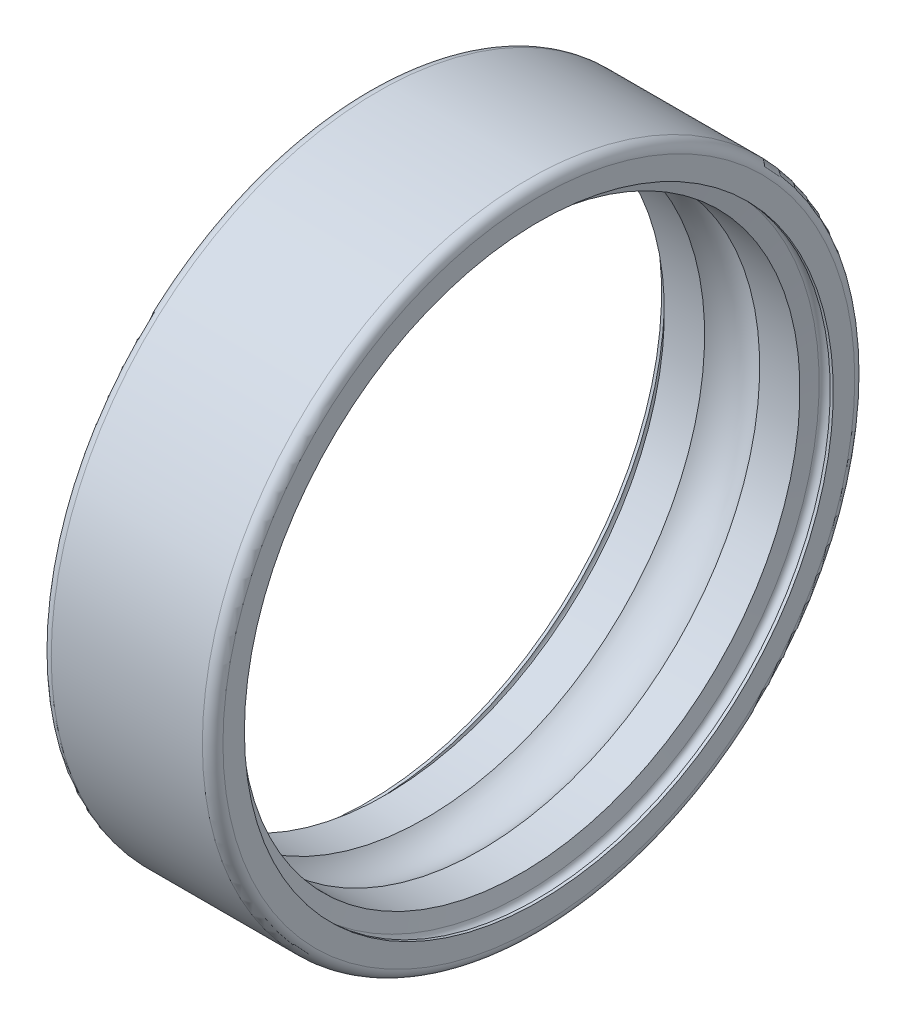
ISO-10303-21;
HEADER;
FILE_DESCRIPTION(('STEP AP214'),'2;1');
FILE_NAME('part.step','',(''),(''),'','','');
FILE_SCHEMA(('AUTOMOTIVE_DESIGN { 1 0 10303 214 1 1 1 1 }'));
ENDSEC;
DATA;
#1=APPLICATION_CONTEXT('core data for automotive mechanical design processes');
#2=APPLICATION_PROTOCOL_DEFINITION('international standard','automotive_design',2000,#1);
#3=PRODUCT_CONTEXT('',#1,'mechanical');
#4=PRODUCT('Part','Part','',(#3));
#5=PRODUCT_RELATED_PRODUCT_CATEGORY('part','',(#4));
#6=PRODUCT_DEFINITION_FORMATION('','',#4);
#7=PRODUCT_DEFINITION_CONTEXT('part definition',#1,'design');
#8=PRODUCT_DEFINITION('design','',#6,#7);
#9=PRODUCT_DEFINITION_SHAPE('','',#8);
#10=(LENGTH_UNIT() NAMED_UNIT(*) SI_UNIT(.MILLI.,.METRE.));
#11=(NAMED_UNIT(*) PLANE_ANGLE_UNIT() SI_UNIT($,.RADIAN.));
#12=(NAMED_UNIT(*) SI_UNIT($,.STERADIAN.) SOLID_ANGLE_UNIT());
#13=UNCERTAINTY_MEASURE_WITH_UNIT(LENGTH_MEASURE(1.E-05),#10,'distance_accuracy_value','');
#14=(GEOMETRIC_REPRESENTATION_CONTEXT(3) GLOBAL_UNCERTAINTY_ASSIGNED_CONTEXT((#13)) GLOBAL_UNIT_ASSIGNED_CONTEXT((#10,
#11,#12)) REPRESENTATION_CONTEXT('',''));
#15=CARTESIAN_POINT('',(0.,0.,0.));
#16=DIRECTION('',(0.,0.,1.));
#17=DIRECTION('',(1.,0.,0.));
#18=AXIS2_PLACEMENT_3D('',#15,#16,#17);
#19=CARTESIAN_POINT('',(4.47378855666907,0.,0.));
#20=DIRECTION('',(1.,0.,0.));
#21=DIRECTION('',(0.,0.,-1.));
#22=AXIS2_PLACEMENT_3D('',#19,#20,#21);
#23=CONICAL_SURFACE('',#22,8.13,1.39626340159546);
#24=CARTESIAN_POINT('',(4.55770421996383,0.,0.));
#25=DIRECTION('',(-1.,0.,0.));
#26=DIRECTION('',(0.,0.,1.));
#27=AXIS2_PLACEMENT_3D('',#24,#25,#26);
#28=CIRCLE('',#27,8.60590937562471);
#29=CARTESIAN_POINT('',(4.55770421996383,0.,8.60590937562471));
#30=VERTEX_POINT('',#29);
#31=EDGE_CURVE('E10',#30,#30,#28,.T.);
#32=ORIENTED_EDGE('',*,*,#31,.F.);
#33=EDGE_LOOP('',(#32));
#34=FACE_BOUND('',#33,.T.);
#35=CARTESIAN_POINT('',(4.47378855666907,0.,0.));
#36=DIRECTION('',(-1.,0.,0.));
#37=DIRECTION('',(0.,0.,1.));
#38=AXIS2_PLACEMENT_3D('',#35,#36,#37);
#39=CIRCLE('',#38,8.13);
#40=CARTESIAN_POINT('',(4.47378855666907,0.,8.13));
#41=VERTEX_POINT('',#40);
#42=EDGE_CURVE('E80',#41,#41,#39,.T.);
#43=ORIENTED_EDGE('',*,*,#42,.T.);
#44=EDGE_LOOP('',(#43));
#45=FACE_BOUND('',#44,.T.);
#46=ADVANCED_FACE('F14',(#34,#45),#23,.F.);
#47=CARTESIAN_POINT('',(4.733,0.,0.));
#48=DIRECTION('',(-1.,0.,0.));
#49=DIRECTION('',(0.,0.,1.));
#50=AXIS2_PLACEMENT_3D('',#47,#48,#49);
#51=TOROIDAL_SURFACE('',#50,8.575,0.178);
#52=ORIENTED_EDGE('',*,*,#31,.T.);
#53=EDGE_LOOP('',(#52));
#54=FACE_BOUND('',#53,.T.);
#55=CARTESIAN_POINT('',(4.911,0.,0.));
#56=DIRECTION('',(-1.,0.,0.));
#57=DIRECTION('',(0.,0.,1.));
#58=AXIS2_PLACEMENT_3D('',#55,#56,#57);
#59=CIRCLE('',#58,8.575);
#60=CARTESIAN_POINT('',(4.911,0.,8.575));
#61=VERTEX_POINT('',#60);
#62=EDGE_CURVE('E21',#61,#61,#59,.T.);
#63=ORIENTED_EDGE('',*,*,#62,.F.);
#64=EDGE_LOOP('',(#63));
#65=FACE_BOUND('',#64,.T.);
#66=ADVANCED_FACE('F105',(#54,#65),#51,.F.);
#67=CARTESIAN_POINT('',(0.,0.,0.));
#68=DIRECTION('',(-1.,0.,0.));
#69=DIRECTION('',(0.,0.,1.));
#70=AXIS2_PLACEMENT_3D('',#67,#68,#69);
#71=CYLINDRICAL_SURFACE('',#70,8.575);
#72=ORIENTED_EDGE('',*,*,#62,.T.);
#73=EDGE_LOOP('',(#72));
#74=FACE_BOUND('',#73,.T.);
#75=CARTESIAN_POINT('',(5.,0.,0.));
#76=DIRECTION('',(-1.,0.,0.));
#77=DIRECTION('',(0.,0.,1.));
#78=AXIS2_PLACEMENT_3D('',#75,#76,#77);
#79=CIRCLE('',#78,8.575);
#80=CARTESIAN_POINT('',(5.,0.,8.575));
#81=VERTEX_POINT('',#80);
#82=EDGE_CURVE('E30',#81,#81,#79,.T.);
#83=ORIENTED_EDGE('',*,*,#82,.F.);
#84=EDGE_LOOP('',(#83));
#85=FACE_BOUND('',#84,.T.);
#86=ADVANCED_FACE('F110',(#74,#85),#71,.F.);
#87=CARTESIAN_POINT('',(5.,8.575,0.));
#88=DIRECTION('',(-1.,0.,0.));
#89=DIRECTION('',(0.,0.,1.));
#90=AXIS2_PLACEMENT_3D('',#87,#88,#89);
#91=PLANE('',#90);
#92=CARTESIAN_POINT('',(5.,0.,0.));
#93=DIRECTION('',(-1.,0.,0.));
#94=DIRECTION('',(0.,0.,1.));
#95=AXIS2_PLACEMENT_3D('',#92,#93,#94);
#96=CIRCLE('',#95,9.2);
#97=CARTESIAN_POINT('',(5.,0.,9.2));
#98=VERTEX_POINT('',#97);
#99=EDGE_CURVE('E38',#98,#98,#96,.T.);
#100=ORIENTED_EDGE('',*,*,#99,.F.);
#101=EDGE_LOOP('',(#100));
#102=FACE_BOUND('',#101,.T.);
#103=ORIENTED_EDGE('',*,*,#82,.T.);
#104=EDGE_LOOP('',(#103));
#105=FACE_BOUND('',#104,.T.);
#106=ADVANCED_FACE('F114',(#102,#105),#91,.F.);
#107=CARTESIAN_POINT('',(4.7,0.,0.));
#108=DIRECTION('',(-1.,0.,0.));
#109=DIRECTION('',(0.,0.,1.));
#110=AXIS2_PLACEMENT_3D('',#107,#108,#109);
#111=TOROIDAL_SURFACE('',#110,9.2,0.3);
#112=CARTESIAN_POINT('',(4.7,0.,0.));
#113=DIRECTION('',(-1.,0.,0.));
#114=DIRECTION('',(0.,0.,1.));
#115=AXIS2_PLACEMENT_3D('',#112,#113,#114);
#116=CIRCLE('',#115,9.5);
#117=CARTESIAN_POINT('',(4.7,0.,9.5));
#118=VERTEX_POINT('',#117);
#119=EDGE_CURVE('E44',#118,#118,#116,.T.);
#120=ORIENTED_EDGE('',*,*,#119,.F.);
#121=EDGE_LOOP('',(#120));
#122=FACE_BOUND('',#121,.T.);
#123=ORIENTED_EDGE('',*,*,#99,.T.);
#124=EDGE_LOOP('',(#123));
#125=FACE_BOUND('',#124,.T.);
#126=ADVANCED_FACE('F120',(#122,#125),#111,.T.);
#127=CARTESIAN_POINT('',(0.,0.,0.));
#128=DIRECTION('',(-1.,0.,0.));
#129=DIRECTION('',(0.,0.,1.));
#130=AXIS2_PLACEMENT_3D('',#127,#128,#129);
#131=CYLINDRICAL_SURFACE('',#130,9.5);
#132=ORIENTED_EDGE('',*,*,#119,.T.);
#133=EDGE_LOOP('',(#132));
#134=FACE_BOUND('',#133,.T.);
#135=CARTESIAN_POINT('',(0.3,0.,0.));
#136=DIRECTION('',(-1.,0.,0.));
#137=DIRECTION('',(0.,0.,1.));
#138=AXIS2_PLACEMENT_3D('',#135,#136,#137);
#139=CIRCLE('',#138,9.5);
#140=CARTESIAN_POINT('',(0.3,0.,9.5));
#141=VERTEX_POINT('',#140);
#142=EDGE_CURVE('E48',#141,#141,#139,.T.);
#143=ORIENTED_EDGE('',*,*,#142,.F.);
#144=EDGE_LOOP('',(#143));
#145=FACE_BOUND('',#144,.T.);
#146=ADVANCED_FACE('F124',(#134,#145),#131,.T.);
#147=CARTESIAN_POINT('',(0.3,0.,0.));
#148=DIRECTION('',(-1.,0.,0.));
#149=DIRECTION('',(0.,0.,1.));
#150=AXIS2_PLACEMENT_3D('',#147,#148,#149);
#151=TOROIDAL_SURFACE('',#150,9.2,0.3);
#152=CARTESIAN_POINT('',(0.,0.,0.));
#153=DIRECTION('',(-1.,0.,0.));
#154=DIRECTION('',(0.,0.,1.));
#155=AXIS2_PLACEMENT_3D('',#152,#153,#154);
#156=CIRCLE('',#155,9.2);
#157=CARTESIAN_POINT('',(0.,0.,9.2));
#158=VERTEX_POINT('',#157);
#159=EDGE_CURVE('E52',#158,#158,#156,.T.);
#160=ORIENTED_EDGE('',*,*,#159,.F.);
#161=EDGE_LOOP('',(#160));
#162=FACE_BOUND('',#161,.T.);
#163=ORIENTED_EDGE('',*,*,#142,.T.);
#164=EDGE_LOOP('',(#163));
#165=FACE_BOUND('',#164,.T.);
#166=ADVANCED_FACE('F128',(#162,#165),#151,.T.);
#167=CARTESIAN_POINT('',(0.,8.575,0.));
#168=DIRECTION('',(-1.,0.,0.));
#169=DIRECTION('',(0.,0.,1.));
#170=AXIS2_PLACEMENT_3D('',#167,#168,#169);
#171=PLANE('',#170);
#172=ORIENTED_EDGE('',*,*,#159,.T.);
#173=EDGE_LOOP('',(#172));
#174=FACE_BOUND('',#173,.T.);
#175=CARTESIAN_POINT('',(0.,0.,0.));
#176=DIRECTION('',(-1.,0.,0.));
#177=DIRECTION('',(0.,0.,1.));
#178=AXIS2_PLACEMENT_3D('',#175,#176,#177);
#179=CIRCLE('',#178,8.575);
#180=CARTESIAN_POINT('',(0.,0.,8.575));
#181=VERTEX_POINT('',#180);
#182=EDGE_CURVE('E56',#181,#181,#179,.T.);
#183=ORIENTED_EDGE('',*,*,#182,.F.);
#184=EDGE_LOOP('',(#183));
#185=FACE_BOUND('',#184,.T.);
#186=ADVANCED_FACE('F132',(#174,#185),#171,.T.);
#187=CARTESIAN_POINT('',(0.,0.,0.));
#188=DIRECTION('',(-1.,0.,0.));
#189=DIRECTION('',(0.,0.,1.));
#190=AXIS2_PLACEMENT_3D('',#187,#188,#189);
#191=CYLINDRICAL_SURFACE('',#190,8.575);
#192=CARTESIAN_POINT('',(0.089,0.,0.));
#193=DIRECTION('',(-1.,0.,0.));
#194=DIRECTION('',(0.,0.,1.));
#195=AXIS2_PLACEMENT_3D('',#192,#193,#194);
#196=CIRCLE('',#195,8.575);
#197=CARTESIAN_POINT('',(0.089,0.,8.575));
#198=VERTEX_POINT('',#197);
#199=EDGE_CURVE('E60',#198,#198,#196,.T.);
#200=ORIENTED_EDGE('',*,*,#199,.F.);
#201=EDGE_LOOP('',(#200));
#202=FACE_BOUND('',#201,.T.);
#203=ORIENTED_EDGE('',*,*,#182,.T.);
#204=EDGE_LOOP('',(#203));
#205=FACE_BOUND('',#204,.T.);
#206=ADVANCED_FACE('F136',(#202,#205),#191,.F.);
#207=CARTESIAN_POINT('',(0.267,0.,0.));
#208=DIRECTION('',(-1.,0.,0.));
#209=DIRECTION('',(0.,0.,1.));
#210=AXIS2_PLACEMENT_3D('',#207,#208,#209);
#211=TOROIDAL_SURFACE('',#210,8.575,0.178);
#212=ORIENTED_EDGE('',*,*,#199,.T.);
#213=EDGE_LOOP('',(#212));
#214=FACE_BOUND('',#213,.T.);
#215=CARTESIAN_POINT('',(0.442295780036171,0.,0.));
#216=DIRECTION('',(-1.,0.,0.));
#217=DIRECTION('',(0.,0.,1.));
#218=AXIS2_PLACEMENT_3D('',#215,#216,#217);
#219=CIRCLE('',#218,8.60590937562471);
#220=CARTESIAN_POINT('',(0.442295780036171,0.,8.60590937562471));
#221=VERTEX_POINT('',#220);
#222=EDGE_CURVE('E64',#221,#221,#219,.T.);
#223=ORIENTED_EDGE('',*,*,#222,.F.);
#224=EDGE_LOOP('',(#223));
#225=FACE_BOUND('',#224,.T.);
#226=ADVANCED_FACE('F140',(#214,#225),#211,.F.);
#227=CARTESIAN_POINT('',(0.526211443330928,0.,0.));
#228=DIRECTION('',(-1.,0.,0.));
#229=DIRECTION('',(0.,0.,1.));
#230=AXIS2_PLACEMENT_3D('',#227,#228,#229);
#231=CONICAL_SURFACE('',#230,8.13,1.39626340159546);
#232=ORIENTED_EDGE('',*,*,#222,.T.);
#233=EDGE_LOOP('',(#232));
#234=FACE_BOUND('',#233,.T.);
#235=CARTESIAN_POINT('',(0.526211443330928,0.,0.));
#236=DIRECTION('',(-1.,0.,0.));
#237=DIRECTION('',(0.,0.,1.));
#238=AXIS2_PLACEMENT_3D('',#235,#236,#237);
#239=CIRCLE('',#238,8.13);
#240=CARTESIAN_POINT('',(0.526211443330928,0.,8.13));
#241=VERTEX_POINT('',#240);
#242=EDGE_CURVE('E68',#241,#241,#239,.T.);
#243=ORIENTED_EDGE('',*,*,#242,.F.);
#244=EDGE_LOOP('',(#243));
#245=FACE_BOUND('',#244,.T.);
#246=ADVANCED_FACE('F101',(#234,#245),#231,.F.);
#247=CARTESIAN_POINT('',(0.,0.,0.));
#248=DIRECTION('',(-1.,0.,0.));
#249=DIRECTION('',(0.,0.,1.));
#250=AXIS2_PLACEMENT_3D('',#247,#248,#249);
#251=CYLINDRICAL_SURFACE('',#250,8.13);
#252=CARTESIAN_POINT('',(1.6981956285976,0.,0.));
#253=DIRECTION('',(-1.,0.,0.));
#254=DIRECTION('',(0.,0.,1.));
#255=AXIS2_PLACEMENT_3D('',#252,#253,#254);
#256=CIRCLE('',#255,8.13);
#257=CARTESIAN_POINT('',(1.6981956285976,0.,8.13));
#258=VERTEX_POINT('',#257);
#259=EDGE_CURVE('E72',#258,#258,#256,.T.);
#260=ORIENTED_EDGE('',*,*,#259,.F.);
#261=EDGE_LOOP('',(#260));
#262=FACE_BOUND('',#261,.T.);
#263=ORIENTED_EDGE('',*,*,#242,.T.);
#264=EDGE_LOOP('',(#263));
#265=FACE_BOUND('',#264,.T.);
#266=ADVANCED_FACE('F94',(#262,#265),#251,.F.);
#267=CARTESIAN_POINT('',(2.5,0.,0.));
#268=DIRECTION('',(-1.,0.,0.));
#269=DIRECTION('',(0.,0.,1.));
#270=AXIS2_PLACEMENT_3D('',#267,#268,#269);
#271=TOROIDAL_SURFACE('',#270,7.25,1.1905);
#272=ORIENTED_EDGE('',*,*,#259,.T.);
#273=EDGE_LOOP('',(#272));
#274=FACE_BOUND('',#273,.T.);
#275=CARTESIAN_POINT('',(3.3018043714024,0.,0.));
#276=DIRECTION('',(-1.,0.,0.));
#277=DIRECTION('',(0.,0.,1.));
#278=AXIS2_PLACEMENT_3D('',#275,#276,#277);
#279=CIRCLE('',#278,8.13);
#280=CARTESIAN_POINT('',(3.3018043714024,0.,8.13));
#281=VERTEX_POINT('',#280);
#282=EDGE_CURVE('E76',#281,#281,#279,.T.);
#283=ORIENTED_EDGE('',*,*,#282,.F.);
#284=EDGE_LOOP('',(#283));
#285=FACE_BOUND('',#284,.T.);
#286=ADVANCED_FACE('F89',(#274,#285),#271,.F.);
#287=CARTESIAN_POINT('',(0.,0.,0.));
#288=DIRECTION('',(-1.,0.,0.));
#289=DIRECTION('',(0.,0.,1.));
#290=AXIS2_PLACEMENT_3D('',#287,#288,#289);
#291=CYLINDRICAL_SURFACE('',#290,8.13);
#292=ORIENTED_EDGE('',*,*,#42,.F.);
#293=EDGE_LOOP('',(#292));
#294=FACE_BOUND('',#293,.T.);
#295=ORIENTED_EDGE('',*,*,#282,.T.);
#296=EDGE_LOOP('',(#295));
#297=FACE_BOUND('',#296,.T.);
#298=ADVANCED_FACE('F86',(#294,#297),#291,.F.);
#299=CLOSED_SHELL('',(#46,#66,#86,#106,#126,#146,#166,#186,#206,#226,#246,#266,#286,#298));
#300=MANIFOLD_SOLID_BREP('B1',#299);
#301=ADVANCED_BREP_SHAPE_REPRESENTATION('',(#18,#300),#14);
#302=SHAPE_DEFINITION_REPRESENTATION(#9,#301);
ENDSEC;
END-ISO-10303-21;
